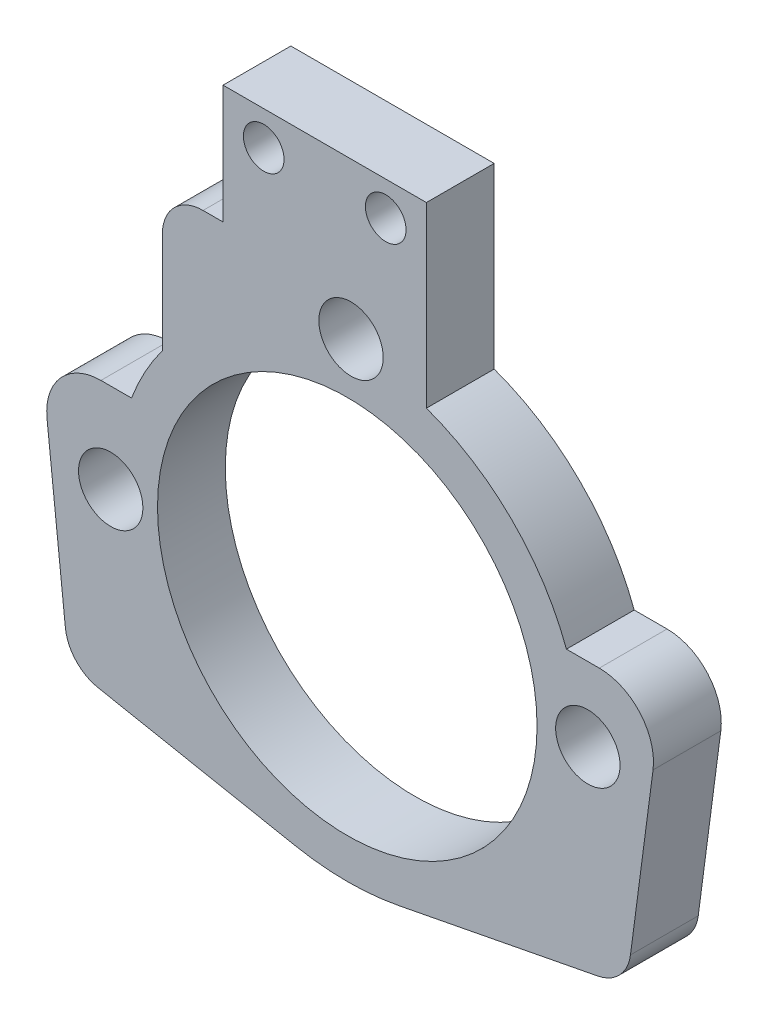
ISO-10303-21;
HEADER;
FILE_DESCRIPTION(('STEP AP214'),'2;1');
FILE_NAME('part.step','',(''),(''),'','','');
FILE_SCHEMA(('AUTOMOTIVE_DESIGN { 1 0 10303 214 1 1 1 1 }'));
ENDSEC;
DATA;
#1=APPLICATION_CONTEXT('core data for automotive mechanical design processes');
#2=APPLICATION_PROTOCOL_DEFINITION('international standard','automotive_design',2000,#1);
#3=PRODUCT_CONTEXT('',#1,'mechanical');
#4=PRODUCT('Part','Part','',(#3));
#5=PRODUCT_RELATED_PRODUCT_CATEGORY('part','',(#4));
#6=PRODUCT_DEFINITION_FORMATION('','',#4);
#7=PRODUCT_DEFINITION_CONTEXT('part definition',#1,'design');
#8=PRODUCT_DEFINITION('design','',#6,#7);
#9=PRODUCT_DEFINITION_SHAPE('','',#8);
#10=(LENGTH_UNIT() NAMED_UNIT(*) SI_UNIT(.MILLI.,.METRE.));
#11=(NAMED_UNIT(*) PLANE_ANGLE_UNIT() SI_UNIT($,.RADIAN.));
#12=(NAMED_UNIT(*) SI_UNIT($,.STERADIAN.) SOLID_ANGLE_UNIT());
#13=UNCERTAINTY_MEASURE_WITH_UNIT(LENGTH_MEASURE(1.E-05),#10,'distance_accuracy_value','');
#14=(GEOMETRIC_REPRESENTATION_CONTEXT(3) GLOBAL_UNCERTAINTY_ASSIGNED_CONTEXT((#13)) GLOBAL_UNIT_ASSIGNED_CONTEXT((#10,
#11,#12)) REPRESENTATION_CONTEXT('',''));
#15=CARTESIAN_POINT('',(0.,0.,0.));
#16=DIRECTION('',(0.,0.,1.));
#17=DIRECTION('',(1.,0.,0.));
#18=AXIS2_PLACEMENT_3D('',#15,#16,#17);
#19=CARTESIAN_POINT('',(-0.276312073786537,-0.751612003694863,5.));
#20=DIRECTION('',(0.,0.,1.));
#21=DIRECTION('',(1.,0.,0.));
#22=AXIS2_PLACEMENT_3D('',#19,#20,#21);
#23=PLANE('',#22);
#24=CARTESIAN_POINT('',(2.56,26.1137028283867,5.));
#25=DIRECTION('',(0.,0.,1.));
#26=DIRECTION('',(1.,0.,0.));
#27=AXIS2_PLACEMENT_3D('',#24,#25,#26);
#28=CIRCLE('',#27,1.5);
#29=CARTESIAN_POINT('',(4.06,26.1137028283867,5.));
#30=VERTEX_POINT('',#29);
#31=EDGE_CURVE('E457',#30,#30,#28,.T.);
#32=ORIENTED_EDGE('',*,*,#31,.F.);
#33=EDGE_LOOP('',(#32));
#34=FACE_BOUND('',#33,.T.);
#35=CARTESIAN_POINT('',(17.4702349645461,-0.205387513878748,5.));
#36=DIRECTION('',(0.,0.,1.));
#37=DIRECTION('',(1.,0.,0.));
#38=AXIS2_PLACEMENT_3D('',#35,#36,#37);
#39=CIRCLE('',#38,2.375);
#40=CARTESIAN_POINT('',(19.8452349645461,-0.205387513878748,5.));
#41=VERTEX_POINT('',#40);
#42=EDGE_CURVE('E441',#41,#41,#39,.T.);
#43=ORIENTED_EDGE('',*,*,#42,.F.);
#44=EDGE_LOOP('',(#43));
#45=FACE_BOUND('',#44,.T.);
#46=CARTESIAN_POINT('',(-17.7297650354539,-1.352900318581,5.));
#47=DIRECTION('',(0.,0.,1.));
#48=DIRECTION('',(1.,0.,0.));
#49=AXIS2_PLACEMENT_3D('',#46,#47,#48);
#50=CIRCLE('',#49,2.375);
#51=CARTESIAN_POINT('',(-15.3547650354539,-1.352900318581,5.));
#52=VERTEX_POINT('',#51);
#53=EDGE_CURVE('E237',#52,#52,#50,.T.);
#54=ORIENTED_EDGE('',*,*,#53,.F.);
#55=EDGE_LOOP('',(#54));
#56=FACE_BOUND('',#55,.T.);
#57=DIRECTION('',(-1.,0.,0.));
#58=VECTOR('',#57,1.);
#59=CARTESIAN_POINT('',(-9.44,19.8710949295282,5.));
#60=LINE('',#59,#58);
#61=CARTESIAN_POINT('',(-9.44,19.8710949295282,5.));
#62=VERTEX_POINT('',#61);
#63=CARTESIAN_POINT('',(-10.9153841869437,19.8710949295282,5.));
#64=VERTEX_POINT('',#63);
#65=EDGE_CURVE('E211',#62,#64,#60,.T.);
#66=ORIENTED_EDGE('',*,*,#65,.T.);
#67=CARTESIAN_POINT('',(-10.9153841869437,16.8710949295282,5.));
#68=DIRECTION('',(0.,0.,1.));
#69=DIRECTION('',(1.,0.,0.));
#70=AXIS2_PLACEMENT_3D('',#67,#68,#69);
#71=CIRCLE('',#70,3.);
#72=CARTESIAN_POINT('',(-13.9153841869437,16.8710949295282,5.));
#73=VERTEX_POINT('',#72);
#74=EDGE_CURVE('E11',#64,#73,#71,.T.);
#75=ORIENTED_EDGE('',*,*,#74,.T.);
#76=DIRECTION('',(0.,-1.,0.));
#77=VECTOR('',#76,1.);
#78=CARTESIAN_POINT('',(-13.9153841869437,19.8710949295282,5.));
#79=LINE('',#78,#77);
#80=CARTESIAN_POINT('',(-13.9153841869437,9.41227741979388,5.));
#81=VERTEX_POINT('',#80);
#82=EDGE_CURVE('E214',#73,#81,#79,.T.);
#83=ORIENTED_EDGE('',*,*,#82,.T.);
#84=CARTESIAN_POINT('',(-0.276312073786537,-0.751612003694863,5.));
#85=DIRECTION('',(0.,0.,1.));
#86=DIRECTION('',(-1.,0.,0.));
#87=AXIS2_PLACEMENT_3D('',#84,#85,#86);
#88=CIRCLE('',#87,17.0096718463587);
#89=CARTESIAN_POINT('',(-16.1938202377922,5.24520966862629,5.));
#90=VERTEX_POINT('',#89);
#91=EDGE_CURVE('E217',#81,#90,#88,.T.);
#92=ORIENTED_EDGE('',*,*,#91,.T.);
#93=DIRECTION('',(-1.,0.,0.));
#94=VECTOR('',#93,1.);
#95=CARTESIAN_POINT('',(-22.898882880699,5.24520966862629,5.));
#96=LINE('',#95,#94);
#97=CARTESIAN_POINT('',(-18.4491051434623,5.24520966862629,5.));
#98=VERTEX_POINT('',#97);
#99=EDGE_CURVE('E220',#90,#98,#96,.T.);
#100=ORIENTED_EDGE('',*,*,#99,.T.);
#101=CARTESIAN_POINT('',(-18.4491051434623,1.24520966862629,5.));
#102=DIRECTION('',(0.,0.,1.));
#103=DIRECTION('',(1.,0.,0.));
#104=AXIS2_PLACEMENT_3D('',#101,#102,#103);
#105=CIRCLE('',#104,4.);
#106=CARTESIAN_POINT('',(-22.4265021195826,0.820576539503129,5.));
#107=VERTEX_POINT('',#106);
#108=EDGE_CURVE('E311',#98,#107,#105,.T.);
#109=ORIENTED_EDGE('',*,*,#108,.T.);
#110=DIRECTION('',(0.106158282280792,-0.99434924403008,0.));
#111=VECTOR('',#110,1.);
#112=CARTESIAN_POINT('',(-22.898882880699,5.24520966862629,5.));
#113=LINE('',#112,#111);
#114=CARTESIAN_POINT('',(-21.0720965881894,-11.8656886045472,5.));
#115=VERTEX_POINT('',#114);
#116=EDGE_CURVE('E224',#107,#115,#113,.T.);
#117=ORIENTED_EDGE('',*,*,#116,.T.);
#118=CARTESIAN_POINT('',(-18.0890488560991,-11.5472137577048,5.));
#119=DIRECTION('',(0.,0.,1.));
#120=DIRECTION('',(1.,0.,0.));
#121=AXIS2_PLACEMENT_3D('',#118,#119,#120);
#122=CIRCLE('',#121,3.);
#123=CARTESIAN_POINT('',(-18.6603766914114,-14.4923087484645,5.));
#124=VERTEX_POINT('',#123);
#125=EDGE_CURVE('E338',#115,#124,#122,.T.);
#126=ORIENTED_EDGE('',*,*,#125,.T.);
#127=DIRECTION('',(0.981698330253205,-0.190442611770763,0.));
#128=VECTOR('',#127,1.);
#129=CARTESIAN_POINT('',(-20.836749357098,-14.0701076691034,5.));
#130=LINE('',#129,#128);
#131=CARTESIAN_POINT('',(-4.08059987936796,-17.320683504286,5.));
#132=VERTEX_POINT('',#131);
#133=EDGE_CURVE('E228',#124,#132,#130,.T.);
#134=ORIENTED_EDGE('',*,*,#133,.T.);
#135=CARTESIAN_POINT('',(-0.271747643952703,2.31328310077806,5.));
#136=DIRECTION('',(0.,0.,1.));
#137=DIRECTION('',(1.,0.,0.));
#138=AXIS2_PLACEMENT_3D('',#135,#136,#137);
#139=CIRCLE('',#138,20.);
#140=CARTESIAN_POINT('',(3.52830605645788,-17.3223883131053,5.));
#141=VERTEX_POINT('',#140);
#142=EDGE_CURVE('E361',#132,#141,#139,.T.);
#143=ORIENTED_EDGE('',*,*,#142,.T.);
#144=DIRECTION('',(0.981783570694168,0.190002685020529,0.));
#145=VECTOR('',#144,1.);
#146=CARTESIAN_POINT('',(-0.276312073786537,-18.0586887379669,5.));
#147=LINE('',#146,#145);
#148=CARTESIAN_POINT('',(18.2111185401308,-14.4808518698154,5.));
#149=VERTEX_POINT('',#148);
#150=EDGE_CURVE('E276',#141,#149,#147,.T.);
#151=ORIENTED_EDGE('',*,*,#150,.T.);
#152=CARTESIAN_POINT('',(17.6411104850692,-11.5355011577329,5.));
#153=DIRECTION('',(0.,0.,1.));
#154=DIRECTION('',(1.,0.,0.));
#155=AXIS2_PLACEMENT_3D('',#152,#153,#154);
#156=CIRCLE('',#155,3.);
#157=CARTESIAN_POINT('',(20.6154826909739,-11.9267938624201,5.));
#158=VERTEX_POINT('',#157);
#159=EDGE_CURVE('E341',#149,#158,#156,.T.);
#160=ORIENTED_EDGE('',*,*,#159,.T.);
#161=DIRECTION('',(0.130430901562429,0.99145740196824,0.));
#162=VECTOR('',#161,1.);
#163=CARTESIAN_POINT('',(20.3335196418485,-14.0701076691034,5.));
#164=LINE('',#163,#162);
#165=CARTESIAN_POINT('',(22.279686732754,0.72348606237658,5.));
#166=VERTEX_POINT('',#165);
#167=EDGE_CURVE('E182',#158,#166,#164,.T.);
#168=ORIENTED_EDGE('',*,*,#167,.T.);
#169=CARTESIAN_POINT('',(18.313857124881,1.24520966862629,5.));
#170=DIRECTION('',(0.,0.,1.));
#171=DIRECTION('',(1.,0.,0.));
#172=AXIS2_PLACEMENT_3D('',#169,#170,#171);
#173=CIRCLE('',#172,4.);
#174=CARTESIAN_POINT('',(18.313857124881,5.24520966862629,5.));
#175=VERTEX_POINT('',#174);
#176=EDGE_CURVE('E177',#166,#175,#173,.T.);
#177=ORIENTED_EDGE('',*,*,#176,.T.);
#178=DIRECTION('',(-1.,0.,0.));
#179=VECTOR('',#178,1.);
#180=CARTESIAN_POINT('',(22.8745408186768,5.24520966862629,5.));
#181=LINE('',#180,#179);
#182=CARTESIAN_POINT('',(15.8907201785678,5.24520966862629,5.));
#183=VERTEX_POINT('',#182);
#184=EDGE_CURVE('E170',#175,#183,#181,.T.);
#185=ORIENTED_EDGE('',*,*,#184,.T.);
#186=CARTESIAN_POINT('',(-0.276312073786537,-0.751612003694863,5.));
#187=DIRECTION('',(0.,0.,1.));
#188=DIRECTION('',(1.,0.,0.));
#189=AXIS2_PLACEMENT_3D('',#186,#187,#188);
#190=CIRCLE('',#189,17.2433987954314);
#191=CARTESIAN_POINT('',(5.56,15.4740548052735,5.));
#192=VERTEX_POINT('',#191);
#193=EDGE_CURVE('E174',#183,#192,#190,.T.);
#194=ORIENTED_EDGE('',*,*,#193,.T.);
#195=DIRECTION('',(0.,1.,0.));
#196=VECTOR('',#195,1.);
#197=CARTESIAN_POINT('',(5.56,28.6137028283867,5.));
#198=LINE('',#197,#196);
#199=CARTESIAN_POINT('',(5.56,28.6137028283867,5.));
#200=VERTEX_POINT('',#199);
#201=EDGE_CURVE('E199',#192,#200,#198,.T.);
#202=ORIENTED_EDGE('',*,*,#201,.T.);
#203=DIRECTION('',(-1.,0.,0.));
#204=VECTOR('',#203,1.);
#205=CARTESIAN_POINT('',(0.,28.6137028283867,5.));
#206=LINE('',#205,#204);
#207=CARTESIAN_POINT('',(-9.44,28.6137028283867,5.));
#208=VERTEX_POINT('',#207);
#209=EDGE_CURVE('E202',#200,#208,#206,.T.);
#210=ORIENTED_EDGE('',*,*,#209,.T.);
#211=DIRECTION('',(0.,-1.,0.));
#212=VECTOR('',#211,1.);
#213=CARTESIAN_POINT('',(-9.44,19.8710949295282,5.));
#214=LINE('',#213,#212);
#215=EDGE_CURVE('E208',#208,#62,#214,.T.);
#216=ORIENTED_EDGE('',*,*,#215,.T.);
#217=EDGE_LOOP('',(#66,#75,#83,#92,#100,#109,#117,#126,#134,#143,#151,#160,#168,#177,#185,#194,
#202,#210,#216));
#218=FACE_BOUND('',#217,.T.);
#219=CARTESIAN_POINT('',(0.,17.1137028283867,5.));
#220=DIRECTION('',(0.,0.,1.));
#221=DIRECTION('',(1.,0.,0.));
#222=AXIS2_PLACEMENT_3D('',#219,#220,#221);
#223=CIRCLE('',#222,2.375);
#224=CARTESIAN_POINT('',(2.375,17.1137028283867,5.));
#225=VERTEX_POINT('',#224);
#226=EDGE_CURVE('E433',#225,#225,#223,.T.);
#227=ORIENTED_EDGE('',*,*,#226,.F.);
#228=EDGE_LOOP('',(#227));
#229=FACE_BOUND('',#228,.T.);
#230=CARTESIAN_POINT('',(-0.276312073786537,-0.751612003694863,5.));
#231=DIRECTION('',(0.,0.,1.));
#232=DIRECTION('',(1.,0.,0.));
#233=AXIS2_PLACEMENT_3D('',#230,#231,#232);
#234=CIRCLE('',#233,14.);
#235=CARTESIAN_POINT('',(13.7236879262135,-0.751612003694863,5.));
#236=VERTEX_POINT('',#235);
#237=EDGE_CURVE('E449',#236,#236,#234,.T.);
#238=ORIENTED_EDGE('',*,*,#237,.F.);
#239=EDGE_LOOP('',(#238));
#240=FACE_BOUND('',#239,.T.);
#241=CARTESIAN_POINT('',(-6.44,26.1137028283867,5.));
#242=DIRECTION('',(0.,0.,1.));
#243=DIRECTION('',(1.,0.,0.));
#244=AXIS2_PLACEMENT_3D('',#241,#242,#243);
#245=CIRCLE('',#244,1.5);
#246=CARTESIAN_POINT('',(-4.94,26.1137028283867,5.));
#247=VERTEX_POINT('',#246);
#248=EDGE_CURVE('E465',#247,#247,#245,.T.);
#249=ORIENTED_EDGE('',*,*,#248,.F.);
#250=EDGE_LOOP('',(#249));
#251=FACE_BOUND('',#250,.T.);
#252=ADVANCED_FACE('F39',(#34,#45,#56,#218,#229,#240,#251),#23,.T.);
#253=CARTESIAN_POINT('',(-0.276312073786537,-0.751612003694863,0.));
#254=DIRECTION('',(0.,0.,1.));
#255=DIRECTION('',(1.,0.,0.));
#256=AXIS2_PLACEMENT_3D('',#253,#254,#255);
#257=PLANE('',#256);
#258=DIRECTION('',(0.,-1.,0.));
#259=VECTOR('',#258,1.);
#260=CARTESIAN_POINT('',(-13.9153841869437,19.8710949295282,0.));
#261=LINE('',#260,#259);
#262=CARTESIAN_POINT('',(-13.9153841869437,16.8710949295282,0.));
#263=VERTEX_POINT('',#262);
#264=CARTESIAN_POINT('',(-13.9153841869437,9.41227741979388,0.));
#265=VERTEX_POINT('',#264);
#266=EDGE_CURVE('E258',#263,#265,#261,.T.);
#267=ORIENTED_EDGE('',*,*,#266,.F.);
#268=CARTESIAN_POINT('',(-10.9153841869437,16.8710949295282,0.));
#269=DIRECTION('',(0.,0.,1.));
#270=DIRECTION('',(1.,0.,0.));
#271=AXIS2_PLACEMENT_3D('',#268,#269,#270);
#272=CIRCLE('',#271,3.);
#273=CARTESIAN_POINT('',(-10.9153841869437,19.8710949295282,0.));
#274=VERTEX_POINT('',#273);
#275=EDGE_CURVE('E62',#263,#274,#272,.F.);
#276=ORIENTED_EDGE('',*,*,#275,.T.);
#277=DIRECTION('',(-1.,0.,0.));
#278=VECTOR('',#277,1.);
#279=CARTESIAN_POINT('',(-9.44,19.8710949295282,0.));
#280=LINE('',#279,#278);
#281=CARTESIAN_POINT('',(-9.44,19.8710949295282,0.));
#282=VERTEX_POINT('',#281);
#283=EDGE_CURVE('E255',#282,#274,#280,.T.);
#284=ORIENTED_EDGE('',*,*,#283,.F.);
#285=DIRECTION('',(0.,-1.,0.));
#286=VECTOR('',#285,1.);
#287=CARTESIAN_POINT('',(-9.44,19.8710949295282,0.));
#288=LINE('',#287,#286);
#289=CARTESIAN_POINT('',(-9.44,28.6137028283867,0.));
#290=VERTEX_POINT('',#289);
#291=EDGE_CURVE('E252',#290,#282,#288,.T.);
#292=ORIENTED_EDGE('',*,*,#291,.F.);
#293=DIRECTION('',(-1.,0.,0.));
#294=VECTOR('',#293,1.);
#295=CARTESIAN_POINT('',(0.,28.6137028283867,0.));
#296=LINE('',#295,#294);
#297=CARTESIAN_POINT('',(5.56,28.6137028283867,0.));
#298=VERTEX_POINT('',#297);
#299=EDGE_CURVE('E249',#298,#290,#296,.T.);
#300=ORIENTED_EDGE('',*,*,#299,.F.);
#301=DIRECTION('',(0.,1.,0.));
#302=VECTOR('',#301,1.);
#303=CARTESIAN_POINT('',(5.56,28.6137028283867,0.));
#304=LINE('',#303,#302);
#305=CARTESIAN_POINT('',(5.56,15.4740548052735,0.));
#306=VERTEX_POINT('',#305);
#307=EDGE_CURVE('E245',#306,#298,#304,.T.);
#308=ORIENTED_EDGE('',*,*,#307,.F.);
#309=CARTESIAN_POINT('',(-0.276312073786537,-0.751612003694863,0.));
#310=DIRECTION('',(0.,0.,1.));
#311=DIRECTION('',(1.,0.,0.));
#312=AXIS2_PLACEMENT_3D('',#309,#310,#311);
#313=CIRCLE('',#312,17.2433987954314);
#314=CARTESIAN_POINT('',(15.8907201785678,5.24520966862629,0.));
#315=VERTEX_POINT('',#314);
#316=EDGE_CURVE('E242',#315,#306,#313,.T.);
#317=ORIENTED_EDGE('',*,*,#316,.F.);
#318=DIRECTION('',(-1.,0.,0.));
#319=VECTOR('',#318,1.);
#320=CARTESIAN_POINT('',(22.8745408186768,5.24520966862629,0.));
#321=LINE('',#320,#319);
#322=CARTESIAN_POINT('',(18.313857124881,5.24520966862629,0.));
#323=VERTEX_POINT('',#322);
#324=EDGE_CURVE('E188',#323,#315,#321,.T.);
#325=ORIENTED_EDGE('',*,*,#324,.F.);
#326=CARTESIAN_POINT('',(18.313857124881,1.24520966862629,0.));
#327=DIRECTION('',(0.,0.,1.));
#328=DIRECTION('',(1.,0.,0.));
#329=AXIS2_PLACEMENT_3D('',#326,#327,#328);
#330=CIRCLE('',#329,4.);
#331=CARTESIAN_POINT('',(22.279686732754,0.72348606237658,0.));
#332=VERTEX_POINT('',#331);
#333=EDGE_CURVE('E303',#323,#332,#330,.F.);
#334=ORIENTED_EDGE('',*,*,#333,.T.);
#335=DIRECTION('',(0.130430901562429,0.99145740196824,0.));
#336=VECTOR('',#335,1.);
#337=CARTESIAN_POINT('',(20.3335196418485,-14.0701076691034,0.));
#338=LINE('',#337,#336);
#339=CARTESIAN_POINT('',(20.6154826909739,-11.9267938624201,0.));
#340=VERTEX_POINT('',#339);
#341=EDGE_CURVE('E236',#340,#332,#338,.T.);
#342=ORIENTED_EDGE('',*,*,#341,.F.);
#343=CARTESIAN_POINT('',(17.6411104850692,-11.5355011577329,0.));
#344=DIRECTION('',(0.,0.,1.));
#345=DIRECTION('',(1.,0.,0.));
#346=AXIS2_PLACEMENT_3D('',#343,#344,#345);
#347=CIRCLE('',#346,3.);
#348=CARTESIAN_POINT('',(18.2111185401308,-14.4808518698154,0.));
#349=VERTEX_POINT('',#348);
#350=EDGE_CURVE('E330',#340,#349,#347,.F.);
#351=ORIENTED_EDGE('',*,*,#350,.T.);
#352=DIRECTION('',(0.981783570694168,0.190002685020529,0.));
#353=VECTOR('',#352,1.);
#354=CARTESIAN_POINT('',(-0.276312073786537,-18.0586887379669,0.));
#355=LINE('',#354,#353);
#356=CARTESIAN_POINT('',(3.52830605645788,-17.3223883131053,0.));
#357=VERTEX_POINT('',#356);
#358=EDGE_CURVE('E233',#357,#349,#355,.T.);
#359=ORIENTED_EDGE('',*,*,#358,.F.);
#360=CARTESIAN_POINT('',(-0.271747643952703,2.31328310077806,0.));
#361=DIRECTION('',(0.,0.,1.));
#362=DIRECTION('',(1.,0.,0.));
#363=AXIS2_PLACEMENT_3D('',#360,#361,#362);
#364=CIRCLE('',#363,20.);
#365=CARTESIAN_POINT('',(-4.08059987936796,-17.320683504286,0.));
#366=VERTEX_POINT('',#365);
#367=EDGE_CURVE('E355',#357,#366,#364,.F.);
#368=ORIENTED_EDGE('',*,*,#367,.T.);
#369=DIRECTION('',(0.981698330253205,-0.190442611770763,0.));
#370=VECTOR('',#369,1.);
#371=CARTESIAN_POINT('',(-20.836749357098,-14.0701076691034,0.));
#372=LINE('',#371,#370);
#373=CARTESIAN_POINT('',(-18.6603766914114,-14.4923087484645,0.));
#374=VERTEX_POINT('',#373);
#375=EDGE_CURVE('E272',#374,#366,#372,.T.);
#376=ORIENTED_EDGE('',*,*,#375,.F.);
#377=CARTESIAN_POINT('',(-18.0890488560991,-11.5472137577048,0.));
#378=DIRECTION('',(0.,0.,1.));
#379=DIRECTION('',(1.,0.,0.));
#380=AXIS2_PLACEMENT_3D('',#377,#378,#379);
#381=CIRCLE('',#380,3.);
#382=CARTESIAN_POINT('',(-21.0720965881894,-11.8656886045472,0.));
#383=VERTEX_POINT('',#382);
#384=EDGE_CURVE('E327',#374,#383,#381,.F.);
#385=ORIENTED_EDGE('',*,*,#384,.T.);
#386=DIRECTION('',(0.106158282280792,-0.99434924403008,0.));
#387=VECTOR('',#386,1.);
#388=CARTESIAN_POINT('',(-22.898882880699,5.24520966862629,0.));
#389=LINE('',#388,#387);
#390=CARTESIAN_POINT('',(-22.4265021195826,0.820576539503129,0.));
#391=VERTEX_POINT('',#390);
#392=EDGE_CURVE('E268',#391,#383,#389,.T.);
#393=ORIENTED_EDGE('',*,*,#392,.F.);
#394=CARTESIAN_POINT('',(-18.4491051434623,1.24520966862629,0.));
#395=DIRECTION('',(0.,0.,1.));
#396=DIRECTION('',(1.,0.,0.));
#397=AXIS2_PLACEMENT_3D('',#394,#395,#396);
#398=CIRCLE('',#397,4.);
#399=CARTESIAN_POINT('',(-18.4491051434623,5.24520966862629,0.));
#400=VERTEX_POINT('',#399);
#401=EDGE_CURVE('E300',#391,#400,#398,.F.);
#402=ORIENTED_EDGE('',*,*,#401,.T.);
#403=DIRECTION('',(-1.,0.,0.));
#404=VECTOR('',#403,1.);
#405=CARTESIAN_POINT('',(-22.898882880699,5.24520966862629,0.));
#406=LINE('',#405,#404);
#407=CARTESIAN_POINT('',(-16.1938202377922,5.24520966862629,0.));
#408=VERTEX_POINT('',#407);
#409=EDGE_CURVE('E264',#408,#400,#406,.T.);
#410=ORIENTED_EDGE('',*,*,#409,.F.);
#411=CARTESIAN_POINT('',(-0.276312073786537,-0.751612003694863,0.));
#412=DIRECTION('',(0.,0.,1.));
#413=DIRECTION('',(-1.,0.,0.));
#414=AXIS2_PLACEMENT_3D('',#411,#412,#413);
#415=CIRCLE('',#414,17.0096718463587);
#416=EDGE_CURVE('E261',#265,#408,#415,.T.);
#417=ORIENTED_EDGE('',*,*,#416,.F.);
#418=EDGE_LOOP('',(#267,#276,#284,#292,#300,#308,#317,#325,#334,#342,#351,#359,#368,#376,#385,
#393,#402,#410,#417));
#419=FACE_BOUND('',#418,.T.);
#420=CARTESIAN_POINT('',(-17.7297650354539,-1.352900318581,0.));
#421=DIRECTION('',(0.,0.,1.));
#422=DIRECTION('',(1.,0.,0.));
#423=AXIS2_PLACEMENT_3D('',#420,#421,#422);
#424=CIRCLE('',#423,2.375);
#425=CARTESIAN_POINT('',(-15.3547650354539,-1.352900318581,0.));
#426=VERTEX_POINT('',#425);
#427=EDGE_CURVE('E429',#426,#426,#424,.T.);
#428=ORIENTED_EDGE('',*,*,#427,.T.);
#429=EDGE_LOOP('',(#428));
#430=FACE_BOUND('',#429,.T.);
#431=CARTESIAN_POINT('',(0.,17.1137028283867,0.));
#432=DIRECTION('',(0.,0.,1.));
#433=DIRECTION('',(1.,0.,0.));
#434=AXIS2_PLACEMENT_3D('',#431,#432,#433);
#435=CIRCLE('',#434,2.375);
#436=CARTESIAN_POINT('',(2.375,17.1137028283867,0.));
#437=VERTEX_POINT('',#436);
#438=EDGE_CURVE('E437',#437,#437,#435,.T.);
#439=ORIENTED_EDGE('',*,*,#438,.T.);
#440=EDGE_LOOP('',(#439));
#441=FACE_BOUND('',#440,.T.);
#442=CARTESIAN_POINT('',(17.4702349645461,-0.205387513878748,0.));
#443=DIRECTION('',(0.,0.,1.));
#444=DIRECTION('',(1.,0.,0.));
#445=AXIS2_PLACEMENT_3D('',#442,#443,#444);
#446=CIRCLE('',#445,2.375);
#447=CARTESIAN_POINT('',(19.8452349645461,-0.205387513878748,0.));
#448=VERTEX_POINT('',#447);
#449=EDGE_CURVE('E445',#448,#448,#446,.T.);
#450=ORIENTED_EDGE('',*,*,#449,.T.);
#451=EDGE_LOOP('',(#450));
#452=FACE_BOUND('',#451,.T.);
#453=CARTESIAN_POINT('',(-0.276312073786537,-0.751612003694863,0.));
#454=DIRECTION('',(0.,0.,1.));
#455=DIRECTION('',(1.,0.,0.));
#456=AXIS2_PLACEMENT_3D('',#453,#454,#455);
#457=CIRCLE('',#456,14.);
#458=CARTESIAN_POINT('',(13.7236879262135,-0.751612003694863,0.));
#459=VERTEX_POINT('',#458);
#460=EDGE_CURVE('E453',#459,#459,#457,.T.);
#461=ORIENTED_EDGE('',*,*,#460,.T.);
#462=EDGE_LOOP('',(#461));
#463=FACE_BOUND('',#462,.T.);
#464=CARTESIAN_POINT('',(2.56,26.1137028283867,0.));
#465=DIRECTION('',(0.,0.,1.));
#466=DIRECTION('',(1.,0.,0.));
#467=AXIS2_PLACEMENT_3D('',#464,#465,#466);
#468=CIRCLE('',#467,1.5);
#469=CARTESIAN_POINT('',(4.06,26.1137028283867,0.));
#470=VERTEX_POINT('',#469);
#471=EDGE_CURVE('E461',#470,#470,#468,.T.);
#472=ORIENTED_EDGE('',*,*,#471,.T.);
#473=EDGE_LOOP('',(#472));
#474=FACE_BOUND('',#473,.T.);
#475=CARTESIAN_POINT('',(-6.44,26.1137028283867,0.));
#476=DIRECTION('',(0.,0.,1.));
#477=DIRECTION('',(1.,0.,0.));
#478=AXIS2_PLACEMENT_3D('',#475,#476,#477);
#479=CIRCLE('',#478,1.5);
#480=CARTESIAN_POINT('',(-4.94,26.1137028283867,0.));
#481=VERTEX_POINT('',#480);
#482=EDGE_CURVE('E469',#481,#481,#479,.T.);
#483=ORIENTED_EDGE('',*,*,#482,.T.);
#484=EDGE_LOOP('',(#483));
#485=FACE_BOUND('',#484,.T.);
#486=ADVANCED_FACE('F378',(#419,#430,#441,#452,#463,#474,#485),#257,.F.);
#487=CARTESIAN_POINT('',(-0.276312073786537,-18.0586887379669,5.));
#488=DIRECTION('',(-0.190002685020529,0.981783570694168,0.));
#489=DIRECTION('',(-0.981783570694168,-0.190002685020529,0.));
#490=AXIS2_PLACEMENT_3D('',#487,#488,#489);
#491=PLANE('',#490);
#492=ORIENTED_EDGE('',*,*,#150,.F.);
#493=DIRECTION('',(0.,0.,-1.));
#494=VECTOR('',#493,1.);
#495=CARTESIAN_POINT('',(3.52830605645788,-17.3223883131053,5.));
#496=LINE('',#495,#494);
#497=EDGE_CURVE('E351',#141,#357,#496,.T.);
#498=ORIENTED_EDGE('',*,*,#497,.T.);
#499=ORIENTED_EDGE('',*,*,#358,.T.);
#500=DIRECTION('',(0.,0.,-1.));
#501=VECTOR('',#500,1.);
#502=CARTESIAN_POINT('',(18.2111185401308,-14.4808518698154,5.));
#503=LINE('',#502,#501);
#504=EDGE_CURVE('E334',#349,#149,#503,.F.);
#505=ORIENTED_EDGE('',*,*,#504,.T.);
#506=EDGE_LOOP('',(#492,#498,#499,#505));
#507=FACE_BOUND('',#506,.T.);
#508=ADVANCED_FACE('F414',(#507),#491,.F.);
#509=CARTESIAN_POINT('',(20.3335196418485,-14.0701076691034,5.));
#510=DIRECTION('',(-0.99145740196824,0.130430901562429,0.));
#511=DIRECTION('',(-0.130430901562429,-0.99145740196824,0.));
#512=AXIS2_PLACEMENT_3D('',#509,#510,#511);
#513=PLANE('',#512);
#514=ORIENTED_EDGE('',*,*,#167,.F.);
#515=DIRECTION('',(0.,0.,-1.));
#516=VECTOR('',#515,1.);
#517=CARTESIAN_POINT('',(20.6154826909739,-11.9267938624201,5.));
#518=LINE('',#517,#516);
#519=EDGE_CURVE('E323',#158,#340,#518,.T.);
#520=ORIENTED_EDGE('',*,*,#519,.T.);
#521=ORIENTED_EDGE('',*,*,#341,.T.);
#522=DIRECTION('',(0.,0.,-1.));
#523=VECTOR('',#522,1.);
#524=CARTESIAN_POINT('',(22.279686732754,0.72348606237658,5.));
#525=LINE('',#524,#523);
#526=EDGE_CURVE('E307',#332,#166,#525,.F.);
#527=ORIENTED_EDGE('',*,*,#526,.T.);
#528=EDGE_LOOP('',(#514,#520,#521,#527));
#529=FACE_BOUND('',#528,.T.);
#530=ADVANCED_FACE('F423',(#529),#513,.F.);
#531=CARTESIAN_POINT('',(22.8745408186768,5.24520966862629,5.));
#532=DIRECTION('',(0.,-1.,0.));
#533=DIRECTION('',(0.,0.,-1.));
#534=AXIS2_PLACEMENT_3D('',#531,#532,#533);
#535=PLANE('',#534);
#536=ORIENTED_EDGE('',*,*,#184,.F.);
#537=DIRECTION('',(0.,0.,-1.));
#538=VECTOR('',#537,1.);
#539=CARTESIAN_POINT('',(18.313857124881,5.24520966862629,5.));
#540=LINE('',#539,#538);
#541=EDGE_CURVE('E192',#175,#323,#540,.T.);
#542=ORIENTED_EDGE('',*,*,#541,.T.);
#543=ORIENTED_EDGE('',*,*,#324,.T.);
#544=DIRECTION('',(0.,0.,-1.));
#545=VECTOR('',#544,1.);
#546=CARTESIAN_POINT('',(15.8907201785678,5.24520966862629,5.));
#547=LINE('',#546,#545);
#548=EDGE_CURVE('E185',#183,#315,#547,.T.);
#549=ORIENTED_EDGE('',*,*,#548,.F.);
#550=EDGE_LOOP('',(#536,#542,#543,#549));
#551=FACE_BOUND('',#550,.T.);
#552=ADVANCED_FACE('F186',(#551),#535,.F.);
#553=CARTESIAN_POINT('',(-0.276312073786537,-0.751612003694863,5.));
#554=DIRECTION('',(0.,0.,-1.));
#555=DIRECTION('',(-1.,0.,0.));
#556=AXIS2_PLACEMENT_3D('',#553,#554,#555);
#557=CYLINDRICAL_SURFACE('',#556,17.2433987954314);
#558=ORIENTED_EDGE('',*,*,#316,.T.);
#559=DIRECTION('',(0.,0.,-1.));
#560=VECTOR('',#559,1.);
#561=CARTESIAN_POINT('',(5.56,15.4740548052735,5.));
#562=LINE('',#561,#560);
#563=EDGE_CURVE('E193',#192,#306,#562,.T.);
#564=ORIENTED_EDGE('',*,*,#563,.F.);
#565=ORIENTED_EDGE('',*,*,#193,.F.);
#566=ORIENTED_EDGE('',*,*,#548,.T.);
#567=EDGE_LOOP('',(#558,#564,#565,#566));
#568=FACE_BOUND('',#567,.T.);
#569=ADVANCED_FACE('F195',(#568),#557,.T.);
#570=CARTESIAN_POINT('',(5.56,28.6137028283867,5.));
#571=DIRECTION('',(-1.,0.,0.));
#572=DIRECTION('',(0.,0.,1.));
#573=AXIS2_PLACEMENT_3D('',#570,#571,#572);
#574=PLANE('',#573);
#575=ORIENTED_EDGE('',*,*,#307,.T.);
#576=DIRECTION('',(0.,0.,-1.));
#577=VECTOR('',#576,1.);
#578=CARTESIAN_POINT('',(5.56,28.6137028283867,5.));
#579=LINE('',#578,#577);
#580=EDGE_CURVE('E292',#200,#298,#579,.T.);
#581=ORIENTED_EDGE('',*,*,#580,.F.);
#582=ORIENTED_EDGE('',*,*,#201,.F.);
#583=ORIENTED_EDGE('',*,*,#563,.T.);
#584=EDGE_LOOP('',(#575,#581,#582,#583));
#585=FACE_BOUND('',#584,.T.);
#586=ADVANCED_FACE('F513',(#585),#574,.F.);
#587=CARTESIAN_POINT('',(0.,28.6137028283867,5.));
#588=DIRECTION('',(0.,-1.,0.));
#589=DIRECTION('',(0.,0.,-1.));
#590=AXIS2_PLACEMENT_3D('',#587,#588,#589);
#591=PLANE('',#590);
#592=ORIENTED_EDGE('',*,*,#299,.T.);
#593=DIRECTION('',(0.,0.,-1.));
#594=VECTOR('',#593,1.);
#595=CARTESIAN_POINT('',(-9.44,28.6137028283867,5.));
#596=LINE('',#595,#594);
#597=EDGE_CURVE('E288',#208,#290,#596,.T.);
#598=ORIENTED_EDGE('',*,*,#597,.F.);
#599=ORIENTED_EDGE('',*,*,#209,.F.);
#600=ORIENTED_EDGE('',*,*,#580,.T.);
#601=EDGE_LOOP('',(#592,#598,#599,#600));
#602=FACE_BOUND('',#601,.T.);
#603=ADVANCED_FACE('F509',(#602),#591,.F.);
#604=CARTESIAN_POINT('',(-9.44,19.8710949295282,5.));
#605=DIRECTION('',(1.,0.,0.));
#606=DIRECTION('',(0.,0.,-1.));
#607=AXIS2_PLACEMENT_3D('',#604,#605,#606);
#608=PLANE('',#607);
#609=ORIENTED_EDGE('',*,*,#291,.T.);
#610=DIRECTION('',(0.,0.,-1.));
#611=VECTOR('',#610,1.);
#612=CARTESIAN_POINT('',(-9.44,19.8710949295282,5.));
#613=LINE('',#612,#611);
#614=EDGE_CURVE('E284',#62,#282,#613,.T.);
#615=ORIENTED_EDGE('',*,*,#614,.F.);
#616=ORIENTED_EDGE('',*,*,#215,.F.);
#617=ORIENTED_EDGE('',*,*,#597,.T.);
#618=EDGE_LOOP('',(#609,#615,#616,#617));
#619=FACE_BOUND('',#618,.T.);
#620=ADVANCED_FACE('F506',(#619),#608,.F.);
#621=CARTESIAN_POINT('',(-9.44,19.8710949295282,5.));
#622=DIRECTION('',(0.,-1.,0.));
#623=DIRECTION('',(0.,0.,-1.));
#624=AXIS2_PLACEMENT_3D('',#621,#622,#623);
#625=PLANE('',#624);
#626=ORIENTED_EDGE('',*,*,#283,.T.);
#627=DIRECTION('',(0.,0.,-1.));
#628=VECTOR('',#627,1.);
#629=CARTESIAN_POINT('',(-10.9153841869437,19.8710949295282,5.));
#630=LINE('',#629,#628);
#631=EDGE_CURVE('E48',#274,#64,#630,.F.);
#632=ORIENTED_EDGE('',*,*,#631,.T.);
#633=ORIENTED_EDGE('',*,*,#65,.F.);
#634=ORIENTED_EDGE('',*,*,#614,.T.);
#635=EDGE_LOOP('',(#626,#632,#633,#634));
#636=FACE_BOUND('',#635,.T.);
#637=ADVANCED_FACE('F503',(#636),#625,.F.);
#638=CARTESIAN_POINT('',(-13.9153841869437,19.8710949295282,5.));
#639=DIRECTION('',(1.,0.,0.));
#640=DIRECTION('',(0.,0.,-1.));
#641=AXIS2_PLACEMENT_3D('',#638,#639,#640);
#642=PLANE('',#641);
#643=ORIENTED_EDGE('',*,*,#82,.F.);
#644=DIRECTION('',(0.,0.,-1.));
#645=VECTOR('',#644,1.);
#646=CARTESIAN_POINT('',(-13.9153841869437,16.8710949295282,5.));
#647=LINE('',#646,#645);
#648=EDGE_CURVE('E364',#73,#263,#647,.T.);
#649=ORIENTED_EDGE('',*,*,#648,.T.);
#650=ORIENTED_EDGE('',*,*,#266,.T.);
#651=DIRECTION('',(0.,0.,-1.));
#652=VECTOR('',#651,1.);
#653=CARTESIAN_POINT('',(-13.9153841869437,9.41227741979388,5.));
#654=LINE('',#653,#652);
#655=EDGE_CURVE('E280',#81,#265,#654,.T.);
#656=ORIENTED_EDGE('',*,*,#655,.F.);
#657=EDGE_LOOP('',(#643,#649,#650,#656));
#658=FACE_BOUND('',#657,.T.);
#659=ADVANCED_FACE('F373',(#658),#642,.F.);
#660=CARTESIAN_POINT('',(-0.276312073786537,-0.751612003694863,5.));
#661=DIRECTION('',(0.,0.,-1.));
#662=DIRECTION('',(-1.,0.,0.));
#663=AXIS2_PLACEMENT_3D('',#660,#661,#662);
#664=CYLINDRICAL_SURFACE('',#663,17.0096718463587);
#665=ORIENTED_EDGE('',*,*,#416,.T.);
#666=DIRECTION('',(0.,0.,-1.));
#667=VECTOR('',#666,1.);
#668=CARTESIAN_POINT('',(-16.1938202377922,5.24520966862629,5.));
#669=LINE('',#668,#667);
#670=EDGE_CURVE('E232',#90,#408,#669,.T.);
#671=ORIENTED_EDGE('',*,*,#670,.F.);
#672=ORIENTED_EDGE('',*,*,#91,.F.);
#673=ORIENTED_EDGE('',*,*,#655,.T.);
#674=EDGE_LOOP('',(#665,#671,#672,#673));
#675=FACE_BOUND('',#674,.T.);
#676=ADVANCED_FACE('F383',(#675),#664,.T.);
#677=CARTESIAN_POINT('',(-22.898882880699,5.24520966862629,5.));
#678=DIRECTION('',(0.,-1.,0.));
#679=DIRECTION('',(0.,0.,-1.));
#680=AXIS2_PLACEMENT_3D('',#677,#678,#679);
#681=PLANE('',#680);
#682=ORIENTED_EDGE('',*,*,#409,.T.);
#683=DIRECTION('',(0.,0.,-1.));
#684=VECTOR('',#683,1.);
#685=CARTESIAN_POINT('',(-18.4491051434623,5.24520966862629,5.));
#686=LINE('',#685,#684);
#687=EDGE_CURVE('E320',#400,#98,#686,.F.);
#688=ORIENTED_EDGE('',*,*,#687,.T.);
#689=ORIENTED_EDGE('',*,*,#99,.F.);
#690=ORIENTED_EDGE('',*,*,#670,.T.);
#691=EDGE_LOOP('',(#682,#688,#689,#690));
#692=FACE_BOUND('',#691,.T.);
#693=ADVANCED_FACE('F387',(#692),#681,.F.);
#694=CARTESIAN_POINT('',(-22.898882880699,5.24520966862629,5.));
#695=DIRECTION('',(0.99434924403008,0.106158282280792,0.));
#696=DIRECTION('',(-0.106158282280792,0.99434924403008,0.));
#697=AXIS2_PLACEMENT_3D('',#694,#695,#696);
#698=PLANE('',#697);
#699=ORIENTED_EDGE('',*,*,#392,.T.);
#700=DIRECTION('',(0.,0.,-1.));
#701=VECTOR('',#700,1.);
#702=CARTESIAN_POINT('',(-21.0720965881894,-11.8656886045472,5.));
#703=LINE('',#702,#701);
#704=EDGE_CURVE('E348',#383,#115,#703,.F.);
#705=ORIENTED_EDGE('',*,*,#704,.T.);
#706=ORIENTED_EDGE('',*,*,#116,.F.);
#707=DIRECTION('',(0.,0.,-1.));
#708=VECTOR('',#707,1.);
#709=CARTESIAN_POINT('',(-22.4265021195826,0.820576539503128,5.));
#710=LINE('',#709,#708);
#711=EDGE_CURVE('E316',#107,#391,#710,.T.);
#712=ORIENTED_EDGE('',*,*,#711,.T.);
#713=EDGE_LOOP('',(#699,#705,#706,#712));
#714=FACE_BOUND('',#713,.T.);
#715=ADVANCED_FACE('F396',(#714),#698,.F.);
#716=CARTESIAN_POINT('',(-20.836749357098,-14.0701076691034,5.));
#717=DIRECTION('',(0.190442611770763,0.981698330253205,0.));
#718=DIRECTION('',(-0.981698330253205,0.190442611770763,0.));
#719=AXIS2_PLACEMENT_3D('',#716,#717,#718);
#720=PLANE('',#719);
#721=ORIENTED_EDGE('',*,*,#375,.T.);
#722=DIRECTION('',(0.,0.,-1.));
#723=VECTOR('',#722,1.);
#724=CARTESIAN_POINT('',(-4.08059987936796,-17.320683504286,5.));
#725=LINE('',#724,#723);
#726=EDGE_CURVE('E358',#366,#132,#725,.F.);
#727=ORIENTED_EDGE('',*,*,#726,.T.);
#728=ORIENTED_EDGE('',*,*,#133,.F.);
#729=DIRECTION('',(0.,0.,-1.));
#730=VECTOR('',#729,1.);
#731=CARTESIAN_POINT('',(-18.6603766914114,-14.4923087484645,5.));
#732=LINE('',#731,#730);
#733=EDGE_CURVE('E344',#124,#374,#732,.T.);
#734=ORIENTED_EDGE('',*,*,#733,.T.);
#735=EDGE_LOOP('',(#721,#727,#728,#734));
#736=FACE_BOUND('',#735,.T.);
#737=ADVANCED_FACE('F405',(#736),#720,.F.);
#738=CARTESIAN_POINT('',(-17.7297650354539,-1.352900318581,5.));
#739=DIRECTION('',(0.,0.,-1.));
#740=DIRECTION('',(-1.,0.,0.));
#741=AXIS2_PLACEMENT_3D('',#738,#739,#740);
#742=CYLINDRICAL_SURFACE('',#741,2.375);
#743=ORIENTED_EDGE('',*,*,#53,.T.);
#744=EDGE_LOOP('',(#743));
#745=FACE_BOUND('',#744,.T.);
#746=ORIENTED_EDGE('',*,*,#427,.F.);
#747=EDGE_LOOP('',(#746));
#748=FACE_BOUND('',#747,.T.);
#749=ADVANCED_FACE('F490',(#745,#748),#742,.F.);
#750=CARTESIAN_POINT('',(0.,17.1137028283867,5.));
#751=DIRECTION('',(0.,0.,-1.));
#752=DIRECTION('',(-1.,0.,0.));
#753=AXIS2_PLACEMENT_3D('',#750,#751,#752);
#754=CYLINDRICAL_SURFACE('',#753,2.375);
#755=ORIENTED_EDGE('',*,*,#226,.T.);
#756=EDGE_LOOP('',(#755));
#757=FACE_BOUND('',#756,.T.);
#758=ORIENTED_EDGE('',*,*,#438,.F.);
#759=EDGE_LOOP('',(#758));
#760=FACE_BOUND('',#759,.T.);
#761=ADVANCED_FACE('F677',(#757,#760),#754,.F.);
#762=CARTESIAN_POINT('',(17.4702349645461,-0.205387513878748,5.));
#763=DIRECTION('',(0.,0.,-1.));
#764=DIRECTION('',(-1.,0.,0.));
#765=AXIS2_PLACEMENT_3D('',#762,#763,#764);
#766=CYLINDRICAL_SURFACE('',#765,2.375);
#767=ORIENTED_EDGE('',*,*,#42,.T.);
#768=EDGE_LOOP('',(#767));
#769=FACE_BOUND('',#768,.T.);
#770=ORIENTED_EDGE('',*,*,#449,.F.);
#771=EDGE_LOOP('',(#770));
#772=FACE_BOUND('',#771,.T.);
#773=ADVANCED_FACE('F667',(#769,#772),#766,.F.);
#774=CARTESIAN_POINT('',(-0.276312073786537,-0.751612003694863,5.));
#775=DIRECTION('',(0.,0.,-1.));
#776=DIRECTION('',(-1.,0.,0.));
#777=AXIS2_PLACEMENT_3D('',#774,#775,#776);
#778=CYLINDRICAL_SURFACE('',#777,14.);
#779=ORIENTED_EDGE('',*,*,#237,.T.);
#780=EDGE_LOOP('',(#779));
#781=FACE_BOUND('',#780,.T.);
#782=ORIENTED_EDGE('',*,*,#460,.F.);
#783=EDGE_LOOP('',(#782));
#784=FACE_BOUND('',#783,.T.);
#785=ADVANCED_FACE('F657',(#781,#784),#778,.F.);
#786=CARTESIAN_POINT('',(2.56,26.1137028283867,5.));
#787=DIRECTION('',(0.,0.,-1.));
#788=DIRECTION('',(-1.,0.,0.));
#789=AXIS2_PLACEMENT_3D('',#786,#787,#788);
#790=CYLINDRICAL_SURFACE('',#789,1.5);
#791=ORIENTED_EDGE('',*,*,#31,.T.);
#792=EDGE_LOOP('',(#791));
#793=FACE_BOUND('',#792,.T.);
#794=ORIENTED_EDGE('',*,*,#471,.F.);
#795=EDGE_LOOP('',(#794));
#796=FACE_BOUND('',#795,.T.);
#797=ADVANCED_FACE('F648',(#793,#796),#790,.F.);
#798=CARTESIAN_POINT('',(-6.44,26.1137028283867,5.));
#799=DIRECTION('',(0.,0.,-1.));
#800=DIRECTION('',(-1.,0.,0.));
#801=AXIS2_PLACEMENT_3D('',#798,#799,#800);
#802=CYLINDRICAL_SURFACE('',#801,1.5);
#803=ORIENTED_EDGE('',*,*,#248,.T.);
#804=EDGE_LOOP('',(#803));
#805=FACE_BOUND('',#804,.T.);
#806=ORIENTED_EDGE('',*,*,#482,.F.);
#807=EDGE_LOOP('',(#806));
#808=FACE_BOUND('',#807,.T.);
#809=ADVANCED_FACE('F477',(#805,#808),#802,.F.);
#810=CARTESIAN_POINT('',(18.313857124881,1.24520966862629,5.));
#811=DIRECTION('',(0.,0.,-1.));
#812=DIRECTION('',(-1.,0.,0.));
#813=AXIS2_PLACEMENT_3D('',#810,#811,#812);
#814=CYLINDRICAL_SURFACE('',#813,4.);
#815=ORIENTED_EDGE('',*,*,#176,.F.);
#816=ORIENTED_EDGE('',*,*,#526,.F.);
#817=ORIENTED_EDGE('',*,*,#333,.F.);
#818=ORIENTED_EDGE('',*,*,#541,.F.);
#819=EDGE_LOOP('',(#815,#816,#817,#818));
#820=FACE_BOUND('',#819,.T.);
#821=ADVANCED_FACE('F526',(#820),#814,.T.);
#822=CARTESIAN_POINT('',(-18.4491051434623,1.24520966862629,5.));
#823=DIRECTION('',(0.,0.,-1.));
#824=DIRECTION('',(-1.,0.,0.));
#825=AXIS2_PLACEMENT_3D('',#822,#823,#824);
#826=CYLINDRICAL_SURFACE('',#825,4.);
#827=ORIENTED_EDGE('',*,*,#108,.F.);
#828=ORIENTED_EDGE('',*,*,#687,.F.);
#829=ORIENTED_EDGE('',*,*,#401,.F.);
#830=ORIENTED_EDGE('',*,*,#711,.F.);
#831=EDGE_LOOP('',(#827,#828,#829,#830));
#832=FACE_BOUND('',#831,.T.);
#833=ADVANCED_FACE('F393',(#832),#826,.T.);
#834=CARTESIAN_POINT('',(17.6411104850692,-11.5355011577329,5.));
#835=DIRECTION('',(0.,0.,-1.));
#836=DIRECTION('',(-1.,0.,0.));
#837=AXIS2_PLACEMENT_3D('',#834,#835,#836);
#838=CYLINDRICAL_SURFACE('',#837,3.);
#839=ORIENTED_EDGE('',*,*,#159,.F.);
#840=ORIENTED_EDGE('',*,*,#504,.F.);
#841=ORIENTED_EDGE('',*,*,#350,.F.);
#842=ORIENTED_EDGE('',*,*,#519,.F.);
#843=EDGE_LOOP('',(#839,#840,#841,#842));
#844=FACE_BOUND('',#843,.T.);
#845=ADVANCED_FACE('F420',(#844),#838,.T.);
#846=CARTESIAN_POINT('',(-18.0890488560991,-11.5472137577048,5.));
#847=DIRECTION('',(0.,0.,-1.));
#848=DIRECTION('',(-1.,0.,0.));
#849=AXIS2_PLACEMENT_3D('',#846,#847,#848);
#850=CYLINDRICAL_SURFACE('',#849,3.);
#851=ORIENTED_EDGE('',*,*,#125,.F.);
#852=ORIENTED_EDGE('',*,*,#704,.F.);
#853=ORIENTED_EDGE('',*,*,#384,.F.);
#854=ORIENTED_EDGE('',*,*,#733,.F.);
#855=EDGE_LOOP('',(#851,#852,#853,#854));
#856=FACE_BOUND('',#855,.T.);
#857=ADVANCED_FACE('F402',(#856),#850,.T.);
#858=CARTESIAN_POINT('',(-0.271747643952703,2.31328310077806,5.));
#859=DIRECTION('',(0.,0.,-1.));
#860=DIRECTION('',(-1.,0.,0.));
#861=AXIS2_PLACEMENT_3D('',#858,#859,#860);
#862=CYLINDRICAL_SURFACE('',#861,20.);
#863=ORIENTED_EDGE('',*,*,#142,.F.);
#864=ORIENTED_EDGE('',*,*,#726,.F.);
#865=ORIENTED_EDGE('',*,*,#367,.F.);
#866=ORIENTED_EDGE('',*,*,#497,.F.);
#867=EDGE_LOOP('',(#863,#864,#865,#866));
#868=FACE_BOUND('',#867,.T.);
#869=ADVANCED_FACE('F411',(#868),#862,.T.);
#870=CARTESIAN_POINT('',(-10.9153841869437,16.8710949295282,5.));
#871=DIRECTION('',(0.,0.,-1.));
#872=DIRECTION('',(-1.,0.,0.));
#873=AXIS2_PLACEMENT_3D('',#870,#871,#872);
#874=CYLINDRICAL_SURFACE('',#873,3.);
#875=ORIENTED_EDGE('',*,*,#74,.F.);
#876=ORIENTED_EDGE('',*,*,#631,.F.);
#877=ORIENTED_EDGE('',*,*,#275,.F.);
#878=ORIENTED_EDGE('',*,*,#648,.F.);
#879=EDGE_LOOP('',(#875,#876,#877,#878));
#880=FACE_BOUND('',#879,.T.);
#881=ADVANCED_FACE('F41',(#880),#874,.T.);
#882=CLOSED_SHELL('',(#252,#486,#508,#530,#552,#569,#586,#603,#620,#637,#659,#676,#693,#715,
#737,#749,#761,#773,#785,#797,#809,#821,#833,#845,#857,#869,#881));
#883=MANIFOLD_SOLID_BREP('B2',#882);
#884=ADVANCED_BREP_SHAPE_REPRESENTATION('',(#18,#883),#14);
#885=SHAPE_DEFINITION_REPRESENTATION(#9,#884);
ENDSEC;
END-ISO-10303-21;
